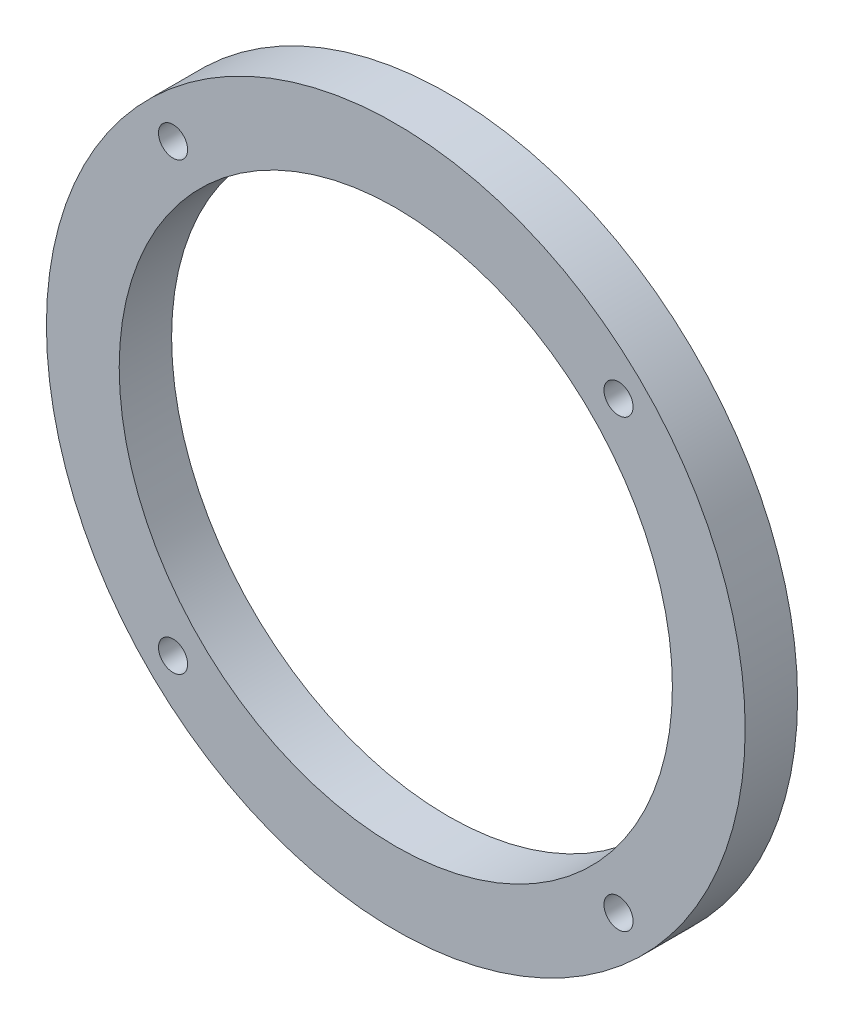
ISO-10303-21;
HEADER;
FILE_DESCRIPTION(('STEP AP214'),'2;1');
FILE_NAME('part.step','',(''),(''),'','','');
FILE_SCHEMA(('AUTOMOTIVE_DESIGN { 1 0 10303 214 1 1 1 1 }'));
ENDSEC;
DATA;
#1=APPLICATION_CONTEXT('core data for automotive mechanical design processes');
#2=APPLICATION_PROTOCOL_DEFINITION('international standard','automotive_design',2000,#1);
#3=PRODUCT_CONTEXT('',#1,'mechanical');
#4=PRODUCT('Part','Part','',(#3));
#5=PRODUCT_RELATED_PRODUCT_CATEGORY('part','',(#4));
#6=PRODUCT_DEFINITION_FORMATION('','',#4);
#7=PRODUCT_DEFINITION_CONTEXT('part definition',#1,'design');
#8=PRODUCT_DEFINITION('design','',#6,#7);
#9=PRODUCT_DEFINITION_SHAPE('','',#8);
#10=(LENGTH_UNIT() NAMED_UNIT(*) SI_UNIT(.MILLI.,.METRE.));
#11=(NAMED_UNIT(*) PLANE_ANGLE_UNIT() SI_UNIT($,.RADIAN.));
#12=(NAMED_UNIT(*) SI_UNIT($,.STERADIAN.) SOLID_ANGLE_UNIT());
#13=UNCERTAINTY_MEASURE_WITH_UNIT(LENGTH_MEASURE(1.E-05),#10,'distance_accuracy_value','');
#14=(GEOMETRIC_REPRESENTATION_CONTEXT(3) GLOBAL_UNCERTAINTY_ASSIGNED_CONTEXT((#13)) GLOBAL_UNIT_ASSIGNED_CONTEXT((#10,
#11,#12)) REPRESENTATION_CONTEXT('',''));
#15=CARTESIAN_POINT('',(0.,0.,0.));
#16=DIRECTION('',(0.,0.,1.));
#17=DIRECTION('',(1.,0.,0.));
#18=AXIS2_PLACEMENT_3D('',#15,#16,#17);
#19=CARTESIAN_POINT('',(0.,0.,9.));
#20=DIRECTION('',(0.,0.,1.));
#21=DIRECTION('',(1.,0.,0.));
#22=AXIS2_PLACEMENT_3D('',#19,#20,#21);
#23=PLANE('',#22);
#24=CARTESIAN_POINT('',(-38.25,38.25,9.));
#25=DIRECTION('',(0.,0.,1.));
#26=DIRECTION('',(1.,0.,0.));
#27=AXIS2_PLACEMENT_3D('',#24,#25,#26);
#28=CIRCLE('',#27,2.50000000000427);
#29=CARTESIAN_POINT('',(-35.7499999999957,38.25,9.));
#30=VERTEX_POINT('',#29);
#31=EDGE_CURVE('E76',#30,#30,#28,.T.);
#32=ORIENTED_EDGE('',*,*,#31,.F.);
#33=EDGE_LOOP('',(#32));
#34=FACE_BOUND('',#33,.T.);
#35=CARTESIAN_POINT('',(-38.25,-38.25,9.));
#36=DIRECTION('',(0.,0.,1.));
#37=DIRECTION('',(1.,0.,0.));
#38=AXIS2_PLACEMENT_3D('',#35,#36,#37);
#39=CIRCLE('',#38,2.50000000000618);
#40=CARTESIAN_POINT('',(-35.7499999999938,-38.25,9.));
#41=VERTEX_POINT('',#40);
#42=EDGE_CURVE('E79',#41,#41,#39,.T.);
#43=ORIENTED_EDGE('',*,*,#42,.F.);
#44=EDGE_LOOP('',(#43));
#45=FACE_BOUND('',#44,.T.);
#46=CARTESIAN_POINT('',(38.25,-38.25,9.));
#47=DIRECTION('',(0.,0.,1.));
#48=DIRECTION('',(1.,0.,0.));
#49=AXIS2_PLACEMENT_3D('',#46,#47,#48);
#50=CIRCLE('',#49,2.50000000000516);
#51=CARTESIAN_POINT('',(40.7500000000051,-38.25,9.));
#52=VERTEX_POINT('',#51);
#53=EDGE_CURVE('E75',#52,#52,#50,.T.);
#54=ORIENTED_EDGE('',*,*,#53,.F.);
#55=EDGE_LOOP('',(#54));
#56=FACE_BOUND('',#55,.T.);
#57=CARTESIAN_POINT('',(38.25,38.25,9.));
#58=DIRECTION('',(0.,0.,1.));
#59=DIRECTION('',(1.,0.,0.));
#60=AXIS2_PLACEMENT_3D('',#57,#58,#59);
#61=CIRCLE('',#60,2.50000000000326);
#62=CARTESIAN_POINT('',(40.7500000000032,38.25,9.));
#63=VERTEX_POINT('',#62);
#64=EDGE_CURVE('E57',#63,#63,#61,.T.);
#65=ORIENTED_EDGE('',*,*,#64,.F.);
#66=EDGE_LOOP('',(#65));
#67=FACE_BOUND('',#66,.T.);
#68=CARTESIAN_POINT('',(0.,0.,9.));
#69=DIRECTION('',(0.,0.,1.));
#70=DIRECTION('',(1.,0.,0.));
#71=AXIS2_PLACEMENT_3D('',#68,#69,#70);
#72=CIRCLE('',#71,60.);
#73=CARTESIAN_POINT('',(60.,0.,9.));
#74=VERTEX_POINT('',#73);
#75=EDGE_CURVE('E10',#74,#74,#72,.T.);
#76=ORIENTED_EDGE('',*,*,#75,.T.);
#77=EDGE_LOOP('',(#76));
#78=FACE_BOUND('',#77,.T.);
#79=CARTESIAN_POINT('',(0.,0.,9.));
#80=DIRECTION('',(0.,0.,1.));
#81=DIRECTION('',(1.,0.,0.));
#82=AXIS2_PLACEMENT_3D('',#79,#80,#81);
#83=CIRCLE('',#82,47.5);
#84=CARTESIAN_POINT('',(47.5,0.,9.));
#85=VERTEX_POINT('',#84);
#86=EDGE_CURVE('E47',#85,#85,#83,.T.);
#87=ORIENTED_EDGE('',*,*,#86,.F.);
#88=EDGE_LOOP('',(#87));
#89=FACE_BOUND('',#88,.T.);
#90=ADVANCED_FACE('F34',(#34,#45,#56,#67,#78,#89),#23,.T.);
#91=CARTESIAN_POINT('',(0.,0.,0.));
#92=DIRECTION('',(0.,0.,1.));
#93=DIRECTION('',(1.,0.,0.));
#94=AXIS2_PLACEMENT_3D('',#91,#92,#93);
#95=PLANE('',#94);
#96=CARTESIAN_POINT('',(-38.25,38.25,0.));
#97=DIRECTION('',(0.,0.,1.));
#98=DIRECTION('',(1.,0.,0.));
#99=AXIS2_PLACEMENT_3D('',#96,#97,#98);
#100=CIRCLE('',#99,2.50000000000427);
#101=CARTESIAN_POINT('',(-35.7499999999957,38.25,0.));
#102=VERTEX_POINT('',#101);
#103=EDGE_CURVE('E38',#102,#102,#100,.T.);
#104=ORIENTED_EDGE('',*,*,#103,.T.);
#105=EDGE_LOOP('',(#104));
#106=FACE_BOUND('',#105,.T.);
#107=CARTESIAN_POINT('',(-38.25,-38.25,0.));
#108=DIRECTION('',(0.,0.,1.));
#109=DIRECTION('',(1.,0.,0.));
#110=AXIS2_PLACEMENT_3D('',#107,#108,#109);
#111=CIRCLE('',#110,2.50000000000618);
#112=CARTESIAN_POINT('',(-35.7499999999938,-38.25,0.));
#113=VERTEX_POINT('',#112);
#114=EDGE_CURVE('E59',#113,#113,#111,.T.);
#115=ORIENTED_EDGE('',*,*,#114,.T.);
#116=EDGE_LOOP('',(#115));
#117=FACE_BOUND('',#116,.T.);
#118=CARTESIAN_POINT('',(38.25,-38.25,0.));
#119=DIRECTION('',(0.,0.,1.));
#120=DIRECTION('',(1.,0.,0.));
#121=AXIS2_PLACEMENT_3D('',#118,#119,#120);
#122=CIRCLE('',#121,2.50000000000516);
#123=CARTESIAN_POINT('',(40.7500000000051,-38.25,0.));
#124=VERTEX_POINT('',#123);
#125=EDGE_CURVE('E56',#124,#124,#122,.T.);
#126=ORIENTED_EDGE('',*,*,#125,.T.);
#127=EDGE_LOOP('',(#126));
#128=FACE_BOUND('',#127,.T.);
#129=CARTESIAN_POINT('',(38.25,38.25,0.));
#130=DIRECTION('',(0.,0.,1.));
#131=DIRECTION('',(1.,0.,0.));
#132=AXIS2_PLACEMENT_3D('',#129,#130,#131);
#133=CIRCLE('',#132,2.50000000000326);
#134=CARTESIAN_POINT('',(40.7500000000032,38.25,0.));
#135=VERTEX_POINT('',#134);
#136=EDGE_CURVE('E53',#135,#135,#133,.T.);
#137=ORIENTED_EDGE('',*,*,#136,.T.);
#138=EDGE_LOOP('',(#137));
#139=FACE_BOUND('',#138,.T.);
#140=CARTESIAN_POINT('',(0.,0.,0.));
#141=DIRECTION('',(0.,0.,1.));
#142=DIRECTION('',(1.,0.,0.));
#143=AXIS2_PLACEMENT_3D('',#140,#141,#142);
#144=CIRCLE('',#143,60.);
#145=CARTESIAN_POINT('',(60.,0.,0.));
#146=VERTEX_POINT('',#145);
#147=EDGE_CURVE('E42',#146,#146,#144,.T.);
#148=ORIENTED_EDGE('',*,*,#147,.F.);
#149=EDGE_LOOP('',(#148));
#150=FACE_BOUND('',#149,.T.);
#151=CARTESIAN_POINT('',(0.,0.,0.));
#152=DIRECTION('',(0.,0.,1.));
#153=DIRECTION('',(1.,0.,0.));
#154=AXIS2_PLACEMENT_3D('',#151,#152,#153);
#155=CIRCLE('',#154,47.5);
#156=CARTESIAN_POINT('',(47.5,0.,0.));
#157=VERTEX_POINT('',#156);
#158=EDGE_CURVE('E50',#157,#157,#155,.T.);
#159=ORIENTED_EDGE('',*,*,#158,.T.);
#160=EDGE_LOOP('',(#159));
#161=FACE_BOUND('',#160,.T.);
#162=ADVANCED_FACE('F90',(#106,#117,#128,#139,#150,#161),#95,.F.);
#163=CARTESIAN_POINT('',(0.,0.,9.));
#164=DIRECTION('',(0.,0.,-1.));
#165=DIRECTION('',(-1.,0.,0.));
#166=AXIS2_PLACEMENT_3D('',#163,#164,#165);
#167=CYLINDRICAL_SURFACE('',#166,60.);
#168=ORIENTED_EDGE('',*,*,#75,.F.);
#169=EDGE_LOOP('',(#168));
#170=FACE_BOUND('',#169,.T.);
#171=ORIENTED_EDGE('',*,*,#147,.T.);
#172=EDGE_LOOP('',(#171));
#173=FACE_BOUND('',#172,.T.);
#174=ADVANCED_FACE('F36',(#170,#173),#167,.T.);
#175=CARTESIAN_POINT('',(0.,0.,9.));
#176=DIRECTION('',(0.,0.,-1.));
#177=DIRECTION('',(-1.,0.,0.));
#178=AXIS2_PLACEMENT_3D('',#175,#176,#177);
#179=CYLINDRICAL_SURFACE('',#178,47.5);
#180=ORIENTED_EDGE('',*,*,#86,.T.);
#181=EDGE_LOOP('',(#180));
#182=FACE_BOUND('',#181,.T.);
#183=ORIENTED_EDGE('',*,*,#158,.F.);
#184=EDGE_LOOP('',(#183));
#185=FACE_BOUND('',#184,.T.);
#186=ADVANCED_FACE('F99',(#182,#185),#179,.F.);
#187=CARTESIAN_POINT('',(38.25,38.25,-1.));
#188=DIRECTION('',(0.,0.,1.));
#189=DIRECTION('',(1.,0.,0.));
#190=AXIS2_PLACEMENT_3D('',#187,#188,#189);
#191=CYLINDRICAL_SURFACE('',#190,2.50000000000326);
#192=ORIENTED_EDGE('',*,*,#64,.T.);
#193=EDGE_LOOP('',(#192));
#194=FACE_BOUND('',#193,.T.);
#195=ORIENTED_EDGE('',*,*,#136,.F.);
#196=EDGE_LOOP('',(#195));
#197=FACE_BOUND('',#196,.T.);
#198=ADVANCED_FACE('F96',(#194,#197),#191,.F.);
#199=CARTESIAN_POINT('',(38.25,-38.25,-1.));
#200=DIRECTION('',(0.,0.,1.));
#201=DIRECTION('',(1.,0.,0.));
#202=AXIS2_PLACEMENT_3D('',#199,#200,#201);
#203=CYLINDRICAL_SURFACE('',#202,2.50000000000516);
#204=ORIENTED_EDGE('',*,*,#53,.T.);
#205=EDGE_LOOP('',(#204));
#206=FACE_BOUND('',#205,.T.);
#207=ORIENTED_EDGE('',*,*,#125,.F.);
#208=EDGE_LOOP('',(#207));
#209=FACE_BOUND('',#208,.T.);
#210=ADVANCED_FACE('F85',(#206,#209),#203,.F.);
#211=CARTESIAN_POINT('',(-38.25,-38.25,-1.));
#212=DIRECTION('',(0.,0.,1.));
#213=DIRECTION('',(1.,0.,0.));
#214=AXIS2_PLACEMENT_3D('',#211,#212,#213);
#215=CYLINDRICAL_SURFACE('',#214,2.50000000000618);
#216=ORIENTED_EDGE('',*,*,#42,.T.);
#217=EDGE_LOOP('',(#216));
#218=FACE_BOUND('',#217,.T.);
#219=ORIENTED_EDGE('',*,*,#114,.F.);
#220=EDGE_LOOP('',(#219));
#221=FACE_BOUND('',#220,.T.);
#222=ADVANCED_FACE('F120',(#218,#221),#215,.F.);
#223=CARTESIAN_POINT('',(-38.25,38.25,-1.));
#224=DIRECTION('',(0.,0.,1.));
#225=DIRECTION('',(1.,0.,0.));
#226=AXIS2_PLACEMENT_3D('',#223,#224,#225);
#227=CYLINDRICAL_SURFACE('',#226,2.50000000000427);
#228=ORIENTED_EDGE('',*,*,#31,.T.);
#229=EDGE_LOOP('',(#228));
#230=FACE_BOUND('',#229,.T.);
#231=ORIENTED_EDGE('',*,*,#103,.F.);
#232=EDGE_LOOP('',(#231));
#233=FACE_BOUND('',#232,.T.);
#234=ADVANCED_FACE('F117',(#230,#233),#227,.F.);
#235=CLOSED_SHELL('',(#90,#162,#174,#186,#198,#210,#222,#234));
#236=MANIFOLD_SOLID_BREP('B2',#235);
#237=ADVANCED_BREP_SHAPE_REPRESENTATION('',(#18,#236),#14);
#238=SHAPE_DEFINITION_REPRESENTATION(#9,#237);
ENDSEC;
END-ISO-10303-21;
